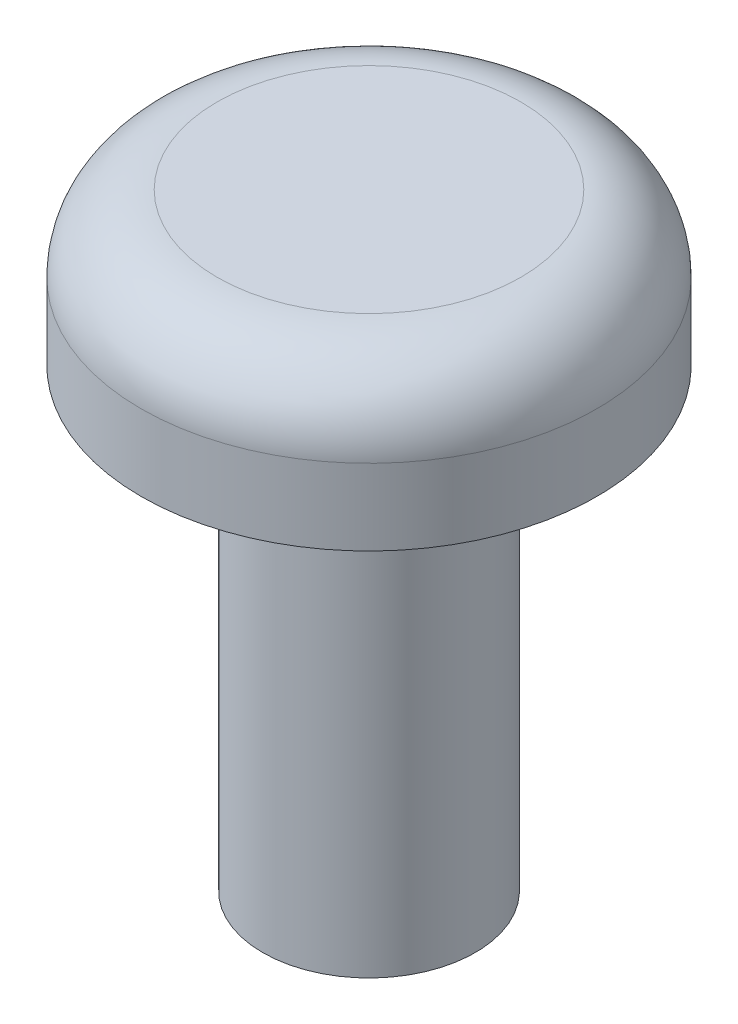
ISO-10303-21;
HEADER;
FILE_DESCRIPTION(('STEP AP214'),'2;1');
FILE_NAME('part.step','',(''),(''),'','','');
FILE_SCHEMA(('AUTOMOTIVE_DESIGN { 1 0 10303 214 1 1 1 1 }'));
ENDSEC;
DATA;
#1=APPLICATION_CONTEXT('core data for automotive mechanical design processes');
#2=APPLICATION_PROTOCOL_DEFINITION('international standard','automotive_design',2000,#1);
#3=PRODUCT_CONTEXT('',#1,'mechanical');
#4=PRODUCT('Part','Part','',(#3));
#5=PRODUCT_RELATED_PRODUCT_CATEGORY('part','',(#4));
#6=PRODUCT_DEFINITION_FORMATION('','',#4);
#7=PRODUCT_DEFINITION_CONTEXT('part definition',#1,'design');
#8=PRODUCT_DEFINITION('design','',#6,#7);
#9=PRODUCT_DEFINITION_SHAPE('','',#8);
#10=(LENGTH_UNIT() NAMED_UNIT(*) SI_UNIT(.MILLI.,.METRE.));
#11=(NAMED_UNIT(*) PLANE_ANGLE_UNIT() SI_UNIT($,.RADIAN.));
#12=(NAMED_UNIT(*) SI_UNIT($,.STERADIAN.) SOLID_ANGLE_UNIT());
#13=UNCERTAINTY_MEASURE_WITH_UNIT(LENGTH_MEASURE(1.E-05),#10,'distance_accuracy_value','');
#14=(GEOMETRIC_REPRESENTATION_CONTEXT(3) GLOBAL_UNCERTAINTY_ASSIGNED_CONTEXT((#13)) GLOBAL_UNIT_ASSIGNED_CONTEXT((#10,
#11,#12)) REPRESENTATION_CONTEXT('',''));
#15=CARTESIAN_POINT('',(0.,0.,0.));
#16=DIRECTION('',(0.,0.,1.));
#17=DIRECTION('',(1.,0.,0.));
#18=AXIS2_PLACEMENT_3D('',#15,#16,#17);
#19=CARTESIAN_POINT('',(0.,6.,0.));
#20=DIRECTION('',(0.,-1.,0.));
#21=DIRECTION('',(0.,0.,-1.));
#22=AXIS2_PLACEMENT_3D('',#19,#20,#21);
#23=CYLINDRICAL_SURFACE('',#22,1.4);
#24=CARTESIAN_POINT('',(0.,6.,0.));
#25=DIRECTION('',(0.,1.,0.));
#26=DIRECTION('',(0.,0.,1.));
#27=AXIS2_PLACEMENT_3D('',#24,#25,#26);
#28=CIRCLE('',#27,1.4);
#29=CARTESIAN_POINT('',(0.,6.,1.4));
#30=VERTEX_POINT('',#29);
#31=EDGE_CURVE('E49',#30,#30,#28,.T.);
#32=ORIENTED_EDGE('',*,*,#31,.F.);
#33=EDGE_LOOP('',(#32));
#34=FACE_BOUND('',#33,.T.);
#35=CARTESIAN_POINT('',(0.,0.,0.));
#36=DIRECTION('',(0.,1.,0.));
#37=DIRECTION('',(0.,0.,1.));
#38=AXIS2_PLACEMENT_3D('',#35,#36,#37);
#39=CIRCLE('',#38,1.4);
#40=CARTESIAN_POINT('',(0.,0.,1.4));
#41=VERTEX_POINT('',#40);
#42=EDGE_CURVE('E54',#41,#41,#39,.T.);
#43=ORIENTED_EDGE('',*,*,#42,.T.);
#44=EDGE_LOOP('',(#43));
#45=FACE_BOUND('',#44,.T.);
#46=ADVANCED_FACE('F36',(#34,#45),#23,.T.);
#47=CARTESIAN_POINT('',(0.,0.,0.));
#48=DIRECTION('',(0.,1.,0.));
#49=DIRECTION('',(0.,0.,1.));
#50=AXIS2_PLACEMENT_3D('',#47,#48,#49);
#51=PLANE('',#50);
#52=ORIENTED_EDGE('',*,*,#42,.F.);
#53=EDGE_LOOP('',(#52));
#54=FACE_BOUND('',#53,.T.);
#55=ADVANCED_FACE('F80',(#54),#51,.F.);
#56=CARTESIAN_POINT('',(0.,8.,0.));
#57=DIRECTION('',(0.,-1.,0.));
#58=DIRECTION('',(0.,0.,-1.));
#59=AXIS2_PLACEMENT_3D('',#56,#57,#58);
#60=CYLINDRICAL_SURFACE('',#59,3.);
#61=CARTESIAN_POINT('',(0.,7.,0.));
#62=DIRECTION('',(0.,1.,0.));
#63=DIRECTION('',(0.,0.,1.));
#64=AXIS2_PLACEMENT_3D('',#61,#62,#63);
#65=CIRCLE('',#64,3.);
#66=CARTESIAN_POINT('',(0.,7.,3.));
#67=VERTEX_POINT('',#66);
#68=EDGE_CURVE('E10',#67,#67,#65,.F.);
#69=ORIENTED_EDGE('',*,*,#68,.T.);
#70=EDGE_LOOP('',(#69));
#71=FACE_BOUND('',#70,.T.);
#72=CARTESIAN_POINT('',(0.,6.,0.));
#73=DIRECTION('',(0.,1.,0.));
#74=DIRECTION('',(0.,0.,1.));
#75=AXIS2_PLACEMENT_3D('',#72,#73,#74);
#76=CIRCLE('',#75,3.);
#77=CARTESIAN_POINT('',(0.,6.,3.));
#78=VERTEX_POINT('',#77);
#79=EDGE_CURVE('E59',#78,#78,#76,.T.);
#80=ORIENTED_EDGE('',*,*,#79,.T.);
#81=EDGE_LOOP('',(#80));
#82=FACE_BOUND('',#81,.T.);
#83=ADVANCED_FACE('F65',(#71,#82),#60,.T.);
#84=CARTESIAN_POINT('',(0.,8.,0.));
#85=DIRECTION('',(0.,1.,0.));
#86=DIRECTION('',(0.,0.,1.));
#87=AXIS2_PLACEMENT_3D('',#84,#85,#86);
#88=PLANE('',#87);
#89=CARTESIAN_POINT('',(0.,8.,0.));
#90=DIRECTION('',(0.,1.,0.));
#91=DIRECTION('',(0.,0.,1.));
#92=AXIS2_PLACEMENT_3D('',#89,#90,#91);
#93=CIRCLE('',#92,2.);
#94=CARTESIAN_POINT('',(0.,8.,2.));
#95=VERTEX_POINT('',#94);
#96=EDGE_CURVE('E44',#95,#95,#93,.T.);
#97=ORIENTED_EDGE('',*,*,#96,.T.);
#98=EDGE_LOOP('',(#97));
#99=FACE_BOUND('',#98,.T.);
#100=ADVANCED_FACE('F69',(#99),#88,.T.);
#101=CARTESIAN_POINT('',(0.,6.,0.));
#102=DIRECTION('',(0.,1.,0.));
#103=DIRECTION('',(0.,0.,1.));
#104=AXIS2_PLACEMENT_3D('',#101,#102,#103);
#105=PLANE('',#104);
#106=ORIENTED_EDGE('',*,*,#31,.T.);
#107=EDGE_LOOP('',(#106));
#108=FACE_BOUND('',#107,.T.);
#109=ORIENTED_EDGE('',*,*,#79,.F.);
#110=EDGE_LOOP('',(#109));
#111=FACE_BOUND('',#110,.T.);
#112=ADVANCED_FACE('F67',(#108,#111),#105,.F.);
#113=CARTESIAN_POINT('',(0.,7.,0.));
#114=DIRECTION('',(0.,1.,0.));
#115=DIRECTION('',(0.,0.,1.));
#116=AXIS2_PLACEMENT_3D('',#113,#114,#115);
#117=TOROIDAL_SURFACE('',#116,2.,1.);
#118=ORIENTED_EDGE('',*,*,#68,.F.);
#119=EDGE_LOOP('',(#118));
#120=FACE_BOUND('',#119,.T.);
#121=ORIENTED_EDGE('',*,*,#96,.F.);
#122=EDGE_LOOP('',(#121));
#123=FACE_BOUND('',#122,.T.);
#124=ADVANCED_FACE('F38',(#120,#123),#117,.T.);
#125=CLOSED_SHELL('',(#46,#55,#83,#100,#112,#124));
#126=MANIFOLD_SOLID_BREP('B2',#125);
#127=ADVANCED_BREP_SHAPE_REPRESENTATION('',(#18,#126),#14);
#128=SHAPE_DEFINITION_REPRESENTATION(#9,#127);
ENDSEC;
END-ISO-10303-21;
